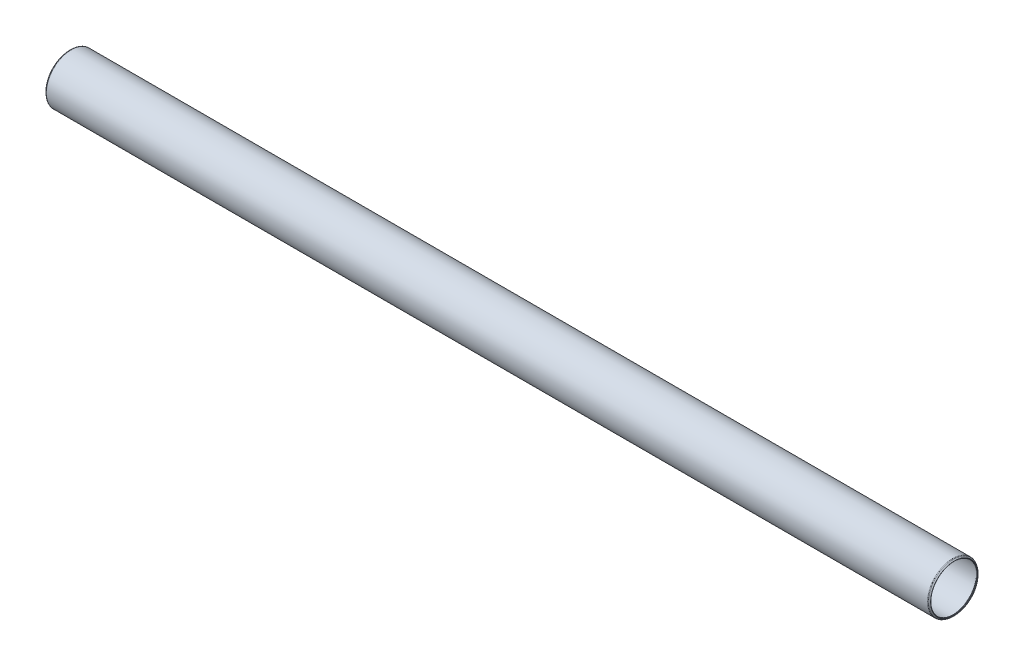
ISO-10303-21;
HEADER;
FILE_DESCRIPTION(('STEP AP214'),'2;1');
FILE_NAME('part.step','',(''),(''),'','','');
FILE_SCHEMA(('AUTOMOTIVE_DESIGN { 1 0 10303 214 1 1 1 1 }'));
ENDSEC;
DATA;
#1=APPLICATION_CONTEXT('core data for automotive mechanical design processes');
#2=APPLICATION_PROTOCOL_DEFINITION('international standard','automotive_design',2000,#1);
#3=PRODUCT_CONTEXT('',#1,'mechanical');
#4=PRODUCT('Part','Part','',(#3));
#5=PRODUCT_RELATED_PRODUCT_CATEGORY('part','',(#4));
#6=PRODUCT_DEFINITION_FORMATION('','',#4);
#7=PRODUCT_DEFINITION_CONTEXT('part definition',#1,'design');
#8=PRODUCT_DEFINITION('design','',#6,#7);
#9=PRODUCT_DEFINITION_SHAPE('','',#8);
#10=(LENGTH_UNIT() NAMED_UNIT(*) SI_UNIT(.MILLI.,.METRE.));
#11=(NAMED_UNIT(*) PLANE_ANGLE_UNIT() SI_UNIT($,.RADIAN.));
#12=(NAMED_UNIT(*) SI_UNIT($,.STERADIAN.) SOLID_ANGLE_UNIT());
#13=UNCERTAINTY_MEASURE_WITH_UNIT(LENGTH_MEASURE(1.E-05),#10,'distance_accuracy_value','');
#14=(GEOMETRIC_REPRESENTATION_CONTEXT(3) GLOBAL_UNCERTAINTY_ASSIGNED_CONTEXT((#13)) GLOBAL_UNIT_ASSIGNED_CONTEXT((#10,
#11,#12)) REPRESENTATION_CONTEXT('',''));
#15=CARTESIAN_POINT('',(0.,0.,0.));
#16=DIRECTION('',(0.,0.,1.));
#17=DIRECTION('',(1.,0.,0.));
#18=AXIS2_PLACEMENT_3D('',#15,#16,#17);
#19=CARTESIAN_POINT('',(467.1949,0.,0.));
#20=DIRECTION('',(-1.,0.,0.));
#21=DIRECTION('',(0.,0.,1.));
#22=AXIS2_PLACEMENT_3D('',#19,#20,#21);
#23=CYLINDRICAL_SURFACE('',#22,25.57145);
#24=CARTESIAN_POINT('',(-466.1408,0.,0.));
#25=DIRECTION('',(1.,0.,0.));
#26=DIRECTION('',(0.,0.,-1.));
#27=AXIS2_PLACEMENT_3D('',#24,#25,#26);
#28=CIRCLE('',#27,25.57145);
#29=CARTESIAN_POINT('',(-466.1408,0.,-25.57145));
#30=VERTEX_POINT('',#29);
#31=EDGE_CURVE('E88',#30,#30,#28,.F.);
#32=ORIENTED_EDGE('',*,*,#31,.T.);
#33=EDGE_LOOP('',(#32));
#34=FACE_BOUND('',#33,.T.);
#35=CARTESIAN_POINT('',(466.1408,0.,0.));
#36=DIRECTION('',(-1.,0.,0.));
#37=DIRECTION('',(0.,0.,1.));
#38=AXIS2_PLACEMENT_3D('',#35,#36,#37);
#39=CIRCLE('',#38,25.57145);
#40=CARTESIAN_POINT('',(466.1408,0.,25.57145));
#41=VERTEX_POINT('',#40);
#42=EDGE_CURVE('E17',#41,#41,#39,.F.);
#43=ORIENTED_EDGE('',*,*,#42,.T.);
#44=EDGE_LOOP('',(#43));
#45=FACE_BOUND('',#44,.T.);
#46=ADVANCED_FACE('F14',(#34,#45),#23,.F.);
#47=CARTESIAN_POINT('',(466.1408,0.,0.));
#48=DIRECTION('',(-1.,0.,0.));
#49=DIRECTION('',(0.,0.,1.));
#50=AXIS2_PLACEMENT_3D('',#47,#48,#49);
#51=CONICAL_SURFACE('',#50,25.57145,0.785398163397475);
#52=CARTESIAN_POINT('',(467.1949,0.,0.));
#53=DIRECTION('',(-1.,0.,0.));
#54=DIRECTION('',(0.,0.,1.));
#55=AXIS2_PLACEMENT_3D('',#52,#53,#54);
#56=CIRCLE('',#55,24.51735);
#57=CARTESIAN_POINT('',(467.1949,0.,24.51735));
#58=VERTEX_POINT('',#57);
#59=EDGE_CURVE('E86',#58,#58,#56,.F.);
#60=ORIENTED_EDGE('',*,*,#59,.T.);
#61=EDGE_LOOP('',(#60));
#62=FACE_BOUND('',#61,.T.);
#63=ORIENTED_EDGE('',*,*,#42,.F.);
#64=EDGE_LOOP('',(#63));
#65=FACE_BOUND('',#64,.T.);
#66=ADVANCED_FACE('F96',(#62,#65),#51,.F.);
#67=CARTESIAN_POINT('',(-466.1408,0.,0.));
#68=DIRECTION('',(1.,0.,0.));
#69=DIRECTION('',(0.,1.,0.));
#70=AXIS2_PLACEMENT_3D('',#67,#68,#69);
#71=CONICAL_SURFACE('',#70,25.57145,0.785398163397475);
#72=CARTESIAN_POINT('',(-467.1949,0.,0.));
#73=DIRECTION('',(-1.,0.,0.));
#74=DIRECTION('',(0.,0.,1.));
#75=AXIS2_PLACEMENT_3D('',#72,#73,#74);
#76=CIRCLE('',#75,24.51735);
#77=CARTESIAN_POINT('',(-467.1949,0.,24.51735));
#78=VERTEX_POINT('',#77);
#79=EDGE_CURVE('E83',#78,#78,#76,.T.);
#80=ORIENTED_EDGE('',*,*,#79,.T.);
#81=EDGE_LOOP('',(#80));
#82=FACE_BOUND('',#81,.T.);
#83=ORIENTED_EDGE('',*,*,#31,.F.);
#84=EDGE_LOOP('',(#83));
#85=FACE_BOUND('',#84,.T.);
#86=ADVANCED_FACE('F98',(#82,#85),#71,.F.);
#87=CARTESIAN_POINT('',(467.1949,0.,0.));
#88=DIRECTION('',(-1.,0.,0.));
#89=DIRECTION('',(0.,0.,1.));
#90=AXIS2_PLACEMENT_3D('',#87,#88,#89);
#91=CYLINDRICAL_SURFACE('',#90,24.51735);
#92=ORIENTED_EDGE('',*,*,#59,.F.);
#93=EDGE_LOOP('',(#92));
#94=FACE_BOUND('',#93,.T.);
#95=CARTESIAN_POINT('',(467.72195,0.,0.));
#96=DIRECTION('',(1.,0.,0.));
#97=DIRECTION('',(0.,0.,-1.));
#98=AXIS2_PLACEMENT_3D('',#95,#96,#97);
#99=CIRCLE('',#98,24.51735);
#100=CARTESIAN_POINT('',(467.72195,0.,-24.51735));
#101=VERTEX_POINT('',#100);
#102=EDGE_CURVE('E80',#101,#101,#99,.T.);
#103=ORIENTED_EDGE('',*,*,#102,.T.);
#104=EDGE_LOOP('',(#103));
#105=FACE_BOUND('',#104,.T.);
#106=ADVANCED_FACE('F105',(#94,#105),#91,.F.);
#107=CARTESIAN_POINT('',(467.1949,0.,0.));
#108=DIRECTION('',(-1.,0.,0.));
#109=DIRECTION('',(0.,0.,1.));
#110=AXIS2_PLACEMENT_3D('',#107,#108,#109);
#111=CYLINDRICAL_SURFACE('',#110,24.51735);
#112=CARTESIAN_POINT('',(-467.72195,0.,0.));
#113=DIRECTION('',(-1.,0.,0.));
#114=DIRECTION('',(0.,0.,1.));
#115=AXIS2_PLACEMENT_3D('',#112,#113,#114);
#116=CIRCLE('',#115,24.51735);
#117=CARTESIAN_POINT('',(-467.72195,0.,24.51735));
#118=VERTEX_POINT('',#117);
#119=EDGE_CURVE('E77',#118,#118,#116,.T.);
#120=ORIENTED_EDGE('',*,*,#119,.T.);
#121=EDGE_LOOP('',(#120));
#122=FACE_BOUND('',#121,.T.);
#123=ORIENTED_EDGE('',*,*,#79,.F.);
#124=EDGE_LOOP('',(#123));
#125=FACE_BOUND('',#124,.T.);
#126=ADVANCED_FACE('F157',(#122,#125),#111,.F.);
#127=CARTESIAN_POINT('',(468.113983696838,0.,0.));
#128=DIRECTION('',(1.,0.,0.));
#129=DIRECTION('',(0.,1.,0.));
#130=AXIS2_PLACEMENT_3D('',#127,#128,#129);
#131=CONICAL_SURFACE('',#130,24.9093836968381,0.785398163397462);
#132=ORIENTED_EDGE('',*,*,#102,.F.);
#133=EDGE_LOOP('',(#132));
#134=FACE_BOUND('',#133,.T.);
#135=CARTESIAN_POINT('',(468.113983696838,0.,0.));
#136=DIRECTION('',(1.,0.,0.));
#137=DIRECTION('',(0.,0.,-1.));
#138=AXIS2_PLACEMENT_3D('',#135,#136,#137);
#139=CIRCLE('',#138,24.9093836968381);
#140=CARTESIAN_POINT('',(468.113983696838,0.,-24.909383696838));
#141=VERTEX_POINT('',#140);
#142=EDGE_CURVE('E74',#141,#141,#139,.F.);
#143=ORIENTED_EDGE('',*,*,#142,.F.);
#144=EDGE_LOOP('',(#143));
#145=FACE_BOUND('',#144,.T.);
#146=ADVANCED_FACE('F150',(#134,#145),#131,.F.);
#147=CARTESIAN_POINT('',(-468.113983696838,0.,0.));
#148=DIRECTION('',(-1.,0.,0.));
#149=DIRECTION('',(0.,0.,1.));
#150=AXIS2_PLACEMENT_3D('',#147,#148,#149);
#151=CONICAL_SURFACE('',#150,24.909383696838,0.785398163397453);
#152=ORIENTED_EDGE('',*,*,#119,.F.);
#153=EDGE_LOOP('',(#152));
#154=FACE_BOUND('',#153,.T.);
#155=CARTESIAN_POINT('',(-468.113983696838,0.,0.));
#156=DIRECTION('',(1.,0.,0.));
#157=DIRECTION('',(0.,0.,-1.));
#158=AXIS2_PLACEMENT_3D('',#155,#156,#157);
#159=CIRCLE('',#158,24.909383696838);
#160=CARTESIAN_POINT('',(-468.113983696838,0.,-24.909383696838));
#161=VERTEX_POINT('',#160);
#162=EDGE_CURVE('E56',#161,#161,#159,.T.);
#163=ORIENTED_EDGE('',*,*,#162,.F.);
#164=EDGE_LOOP('',(#163));
#165=FACE_BOUND('',#164,.T.);
#166=ADVANCED_FACE('F69',(#154,#165),#151,.F.);
#167=CARTESIAN_POINT('',(468.024181135627,0.,0.));
#168=DIRECTION('',(1.,0.,0.));
#169=DIRECTION('',(0.,0.,-1.));
#170=AXIS2_PLACEMENT_3D('',#167,#168,#169);
#171=TOROIDAL_SURFACE('',#170,24.9991862580487,0.126999999999857);
#172=ORIENTED_EDGE('',*,*,#142,.T.);
#173=EDGE_LOOP('',(#172));
#174=FACE_BOUND('',#173,.T.);
#175=CARTESIAN_POINT('',(468.113983696838,0.,0.));
#176=DIRECTION('',(-1.,0.,0.));
#177=DIRECTION('',(0.,0.,1.));
#178=AXIS2_PLACEMENT_3D('',#175,#176,#177);
#179=CIRCLE('',#178,25.0889888192594);
#180=CARTESIAN_POINT('',(468.113983696838,0.,25.0889888192594));
#181=VERTEX_POINT('',#180);
#182=EDGE_CURVE('E53',#181,#181,#179,.T.);
#183=ORIENTED_EDGE('',*,*,#182,.F.);
#184=EDGE_LOOP('',(#183));
#185=FACE_BOUND('',#184,.T.);
#186=ADVANCED_FACE('F65',(#174,#185),#171,.T.);
#187=CARTESIAN_POINT('',(-468.024181135627,0.,0.));
#188=DIRECTION('',(1.,0.,0.));
#189=DIRECTION('',(0.,0.,-1.));
#190=AXIS2_PLACEMENT_3D('',#187,#188,#189);
#191=TOROIDAL_SURFACE('',#190,24.9991862580487,0.126999999999997);
#192=CARTESIAN_POINT('',(-468.113983696838,0.,0.));
#193=DIRECTION('',(1.,0.,0.));
#194=DIRECTION('',(0.,0.,-1.));
#195=AXIS2_PLACEMENT_3D('',#192,#193,#194);
#196=CIRCLE('',#195,25.0889888192594);
#197=CARTESIAN_POINT('',(-468.113983696838,0.,-25.0889888192594));
#198=VERTEX_POINT('',#197);
#199=EDGE_CURVE('E50',#198,#198,#196,.T.);
#200=ORIENTED_EDGE('',*,*,#199,.F.);
#201=EDGE_LOOP('',(#200));
#202=FACE_BOUND('',#201,.T.);
#203=ORIENTED_EDGE('',*,*,#162,.T.);
#204=EDGE_LOOP('',(#203));
#205=FACE_BOUND('',#204,.T.);
#206=ADVANCED_FACE('F61',(#202,#205),#191,.T.);
#207=CARTESIAN_POINT('',(467.025861258049,0.,0.));
#208=DIRECTION('',(-1.,0.,0.));
#209=DIRECTION('',(0.,0.,1.));
#210=AXIS2_PLACEMENT_3D('',#207,#208,#209);
#211=CONICAL_SURFACE('',#210,26.1771112580488,0.785398163397518);
#212=CARTESIAN_POINT('',(467.025861258049,0.,0.));
#213=DIRECTION('',(1.,0.,0.));
#214=DIRECTION('',(0.,0.,-1.));
#215=AXIS2_PLACEMENT_3D('',#212,#213,#214);
#216=CIRCLE('',#215,26.1771112580487);
#217=CARTESIAN_POINT('',(467.025861258049,0.,-26.1771112580487));
#218=VERTEX_POINT('',#217);
#219=EDGE_CURVE('E47',#218,#218,#216,.F.);
#220=ORIENTED_EDGE('',*,*,#219,.F.);
#221=EDGE_LOOP('',(#220));
#222=FACE_BOUND('',#221,.T.);
#223=ORIENTED_EDGE('',*,*,#182,.T.);
#224=EDGE_LOOP('',(#223));
#225=FACE_BOUND('',#224,.T.);
#226=ADVANCED_FACE('F64',(#222,#225),#211,.T.);
#227=CARTESIAN_POINT('',(-467.025861258049,0.,0.));
#228=DIRECTION('',(1.,0.,0.));
#229=DIRECTION('',(0.,0.,-1.));
#230=AXIS2_PLACEMENT_3D('',#227,#228,#229);
#231=CONICAL_SURFACE('',#230,26.1771112580487,0.785398163397447);
#232=CARTESIAN_POINT('',(-467.025861258049,0.,0.));
#233=DIRECTION('',(1.,0.,0.));
#234=DIRECTION('',(0.,0.,-1.));
#235=AXIS2_PLACEMENT_3D('',#232,#233,#234);
#236=CIRCLE('',#235,26.1771112580487);
#237=CARTESIAN_POINT('',(-467.025861258049,0.,-26.1771112580487));
#238=VERTEX_POINT('',#237);
#239=EDGE_CURVE('E26',#238,#238,#236,.T.);
#240=ORIENTED_EDGE('',*,*,#239,.F.);
#241=EDGE_LOOP('',(#240));
#242=FACE_BOUND('',#241,.T.);
#243=ORIENTED_EDGE('',*,*,#199,.T.);
#244=EDGE_LOOP('',(#243));
#245=FACE_BOUND('',#244,.T.);
#246=ADVANCED_FACE('F42',(#242,#245),#231,.T.);
#247=CARTESIAN_POINT('',(466.2805,0.,0.));
#248=DIRECTION('',(1.,0.,0.));
#249=DIRECTION('',(0.,0.,-1.));
#250=AXIS2_PLACEMENT_3D('',#247,#248,#249);
#251=TOROIDAL_SURFACE('',#250,25.4317499999999,1.05410000000011);
#252=ORIENTED_EDGE('',*,*,#219,.T.);
#253=EDGE_LOOP('',(#252));
#254=FACE_BOUND('',#253,.T.);
#255=CARTESIAN_POINT('',(466.2805,0.,0.));
#256=DIRECTION('',(-1.,0.,0.));
#257=DIRECTION('',(0.,0.,1.));
#258=AXIS2_PLACEMENT_3D('',#255,#256,#257);
#259=CIRCLE('',#258,26.48585);
#260=CARTESIAN_POINT('',(466.2805,0.,26.48585));
#261=VERTEX_POINT('',#260);
#262=EDGE_CURVE('E21',#261,#261,#259,.T.);
#263=ORIENTED_EDGE('',*,*,#262,.F.);
#264=EDGE_LOOP('',(#263));
#265=FACE_BOUND('',#264,.T.);
#266=ADVANCED_FACE('F38',(#254,#265),#251,.T.);
#267=CARTESIAN_POINT('',(-466.2805,0.,0.));
#268=DIRECTION('',(1.,0.,0.));
#269=DIRECTION('',(0.,0.,-1.));
#270=AXIS2_PLACEMENT_3D('',#267,#268,#269);
#271=TOROIDAL_SURFACE('',#270,25.43175,1.05410000000003);
#272=CARTESIAN_POINT('',(-466.2805,0.,0.));
#273=DIRECTION('',(-1.,0.,0.));
#274=DIRECTION('',(0.,0.,1.));
#275=AXIS2_PLACEMENT_3D('',#272,#273,#274);
#276=CIRCLE('',#275,26.48585);
#277=CARTESIAN_POINT('',(-466.2805,0.,26.48585));
#278=VERTEX_POINT('',#277);
#279=EDGE_CURVE('E9',#278,#278,#276,.F.);
#280=ORIENTED_EDGE('',*,*,#279,.F.);
#281=EDGE_LOOP('',(#280));
#282=FACE_BOUND('',#281,.T.);
#283=ORIENTED_EDGE('',*,*,#239,.T.);
#284=EDGE_LOOP('',(#283));
#285=FACE_BOUND('',#284,.T.);
#286=ADVANCED_FACE('F33',(#282,#285),#271,.T.);
#287=CARTESIAN_POINT('',(467.1949,0.,0.));
#288=DIRECTION('',(-1.,0.,0.));
#289=DIRECTION('',(0.,0.,1.));
#290=AXIS2_PLACEMENT_3D('',#287,#288,#289);
#291=CYLINDRICAL_SURFACE('',#290,26.48585);
#292=ORIENTED_EDGE('',*,*,#262,.T.);
#293=EDGE_LOOP('',(#292));
#294=FACE_BOUND('',#293,.T.);
#295=ORIENTED_EDGE('',*,*,#279,.T.);
#296=EDGE_LOOP('',(#295));
#297=FACE_BOUND('',#296,.T.);
#298=ADVANCED_FACE('F37',(#294,#297),#291,.T.);
#299=CLOSED_SHELL('',(#46,#66,#86,#106,#126,#146,#166,#186,#206,#226,#246,#266,#286,#298));
#300=MANIFOLD_SOLID_BREP('B1',#299);
#301=ADVANCED_BREP_SHAPE_REPRESENTATION('',(#18,#300),#14);
#302=SHAPE_DEFINITION_REPRESENTATION(#9,#301);
ENDSEC;
END-ISO-10303-21;
